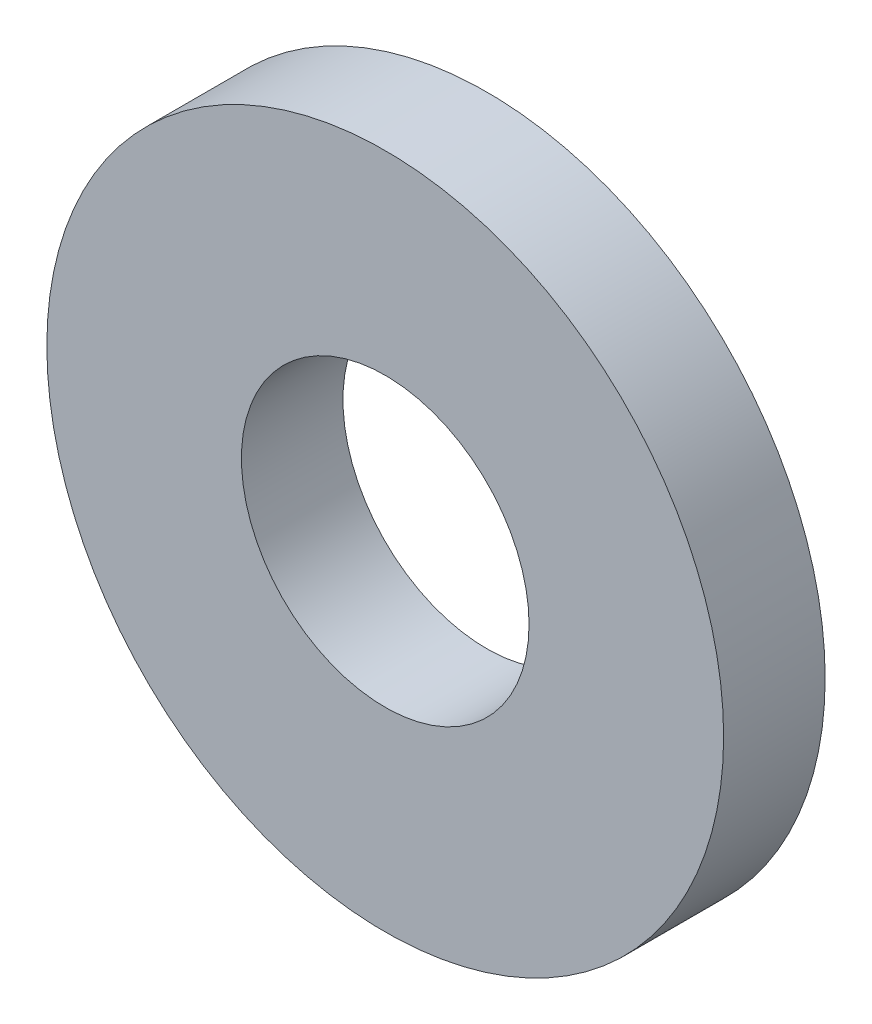
ISO-10303-21;
HEADER;
FILE_DESCRIPTION(('STEP AP214'),'2;1');
FILE_NAME('part.step','',(''),(''),'','','');
FILE_SCHEMA(('AUTOMOTIVE_DESIGN { 1 0 10303 214 1 1 1 1 }'));
ENDSEC;
DATA;
#1=APPLICATION_CONTEXT('core data for automotive mechanical design processes');
#2=APPLICATION_PROTOCOL_DEFINITION('international standard','automotive_design',2000,#1);
#3=PRODUCT_CONTEXT('',#1,'mechanical');
#4=PRODUCT('Part','Part','',(#3));
#5=PRODUCT_RELATED_PRODUCT_CATEGORY('part','',(#4));
#6=PRODUCT_DEFINITION_FORMATION('','',#4);
#7=PRODUCT_DEFINITION_CONTEXT('part definition',#1,'design');
#8=PRODUCT_DEFINITION('design','',#6,#7);
#9=PRODUCT_DEFINITION_SHAPE('','',#8);
#10=(LENGTH_UNIT() NAMED_UNIT(*) SI_UNIT(.MILLI.,.METRE.));
#11=(NAMED_UNIT(*) PLANE_ANGLE_UNIT() SI_UNIT($,.RADIAN.));
#12=(NAMED_UNIT(*) SI_UNIT($,.STERADIAN.) SOLID_ANGLE_UNIT());
#13=UNCERTAINTY_MEASURE_WITH_UNIT(LENGTH_MEASURE(1.E-05),#10,'distance_accuracy_value','');
#14=(GEOMETRIC_REPRESENTATION_CONTEXT(3) GLOBAL_UNCERTAINTY_ASSIGNED_CONTEXT((#13)) GLOBAL_UNIT_ASSIGNED_CONTEXT((#10,
#11,#12)) REPRESENTATION_CONTEXT('',''));
#15=CARTESIAN_POINT('',(0.,0.,0.));
#16=DIRECTION('',(0.,0.,1.));
#17=DIRECTION('',(1.,0.,0.));
#18=AXIS2_PLACEMENT_3D('',#15,#16,#17);
#19=CARTESIAN_POINT('',(349.999999999999,87.,6.));
#20=DIRECTION('',(0.,0.,1.));
#21=DIRECTION('',(1.,0.,0.));
#22=AXIS2_PLACEMENT_3D('',#19,#20,#21);
#23=PLANE('',#22);
#24=CARTESIAN_POINT('',(349.999999999999,87.,6.));
#25=DIRECTION('',(0.,0.,1.));
#26=DIRECTION('',(1.,0.,0.));
#27=AXIS2_PLACEMENT_3D('',#24,#25,#26);
#28=CIRCLE('',#27,20.);
#29=CARTESIAN_POINT('',(369.999999999999,87.,6.));
#30=VERTEX_POINT('',#29);
#31=EDGE_CURVE('E10',#30,#30,#28,.T.);
#32=ORIENTED_EDGE('',*,*,#31,.T.);
#33=EDGE_LOOP('',(#32));
#34=FACE_BOUND('',#33,.T.);
#35=CARTESIAN_POINT('',(349.999999999999,87.,6.));
#36=DIRECTION('',(0.,0.,1.));
#37=DIRECTION('',(1.,0.,0.));
#38=AXIS2_PLACEMENT_3D('',#35,#36,#37);
#39=CIRCLE('',#38,8.50000000000001);
#40=CARTESIAN_POINT('',(358.499999999999,87.,6.));
#41=VERTEX_POINT('',#40);
#42=EDGE_CURVE('E47',#41,#41,#39,.T.);
#43=ORIENTED_EDGE('',*,*,#42,.F.);
#44=EDGE_LOOP('',(#43));
#45=FACE_BOUND('',#44,.T.);
#46=ADVANCED_FACE('F34',(#34,#45),#23,.T.);
#47=CARTESIAN_POINT('',(349.999999999999,87.,0.));
#48=DIRECTION('',(0.,0.,1.));
#49=DIRECTION('',(1.,0.,0.));
#50=AXIS2_PLACEMENT_3D('',#47,#48,#49);
#51=PLANE('',#50);
#52=CARTESIAN_POINT('',(349.999999999999,87.,0.));
#53=DIRECTION('',(0.,0.,1.));
#54=DIRECTION('',(1.,0.,0.));
#55=AXIS2_PLACEMENT_3D('',#52,#53,#54);
#56=CIRCLE('',#55,20.);
#57=CARTESIAN_POINT('',(369.999999999999,87.,0.));
#58=VERTEX_POINT('',#57);
#59=EDGE_CURVE('E38',#58,#58,#56,.T.);
#60=ORIENTED_EDGE('',*,*,#59,.F.);
#61=EDGE_LOOP('',(#60));
#62=FACE_BOUND('',#61,.T.);
#63=CARTESIAN_POINT('',(349.999999999999,87.,0.));
#64=DIRECTION('',(0.,0.,1.));
#65=DIRECTION('',(1.,0.,0.));
#66=AXIS2_PLACEMENT_3D('',#63,#64,#65);
#67=CIRCLE('',#66,8.50000000000001);
#68=CARTESIAN_POINT('',(358.499999999999,87.,0.));
#69=VERTEX_POINT('',#68);
#70=EDGE_CURVE('E49',#69,#69,#67,.T.);
#71=ORIENTED_EDGE('',*,*,#70,.T.);
#72=EDGE_LOOP('',(#71));
#73=FACE_BOUND('',#72,.T.);
#74=ADVANCED_FACE('F61',(#62,#73),#51,.F.);
#75=CARTESIAN_POINT('',(349.999999999999,87.,6.));
#76=DIRECTION('',(0.,0.,-1.));
#77=DIRECTION('',(-1.,0.,0.));
#78=AXIS2_PLACEMENT_3D('',#75,#76,#77);
#79=CYLINDRICAL_SURFACE('',#78,20.);
#80=ORIENTED_EDGE('',*,*,#31,.F.);
#81=EDGE_LOOP('',(#80));
#82=FACE_BOUND('',#81,.T.);
#83=ORIENTED_EDGE('',*,*,#59,.T.);
#84=EDGE_LOOP('',(#83));
#85=FACE_BOUND('',#84,.T.);
#86=ADVANCED_FACE('F36',(#82,#85),#79,.T.);
#87=CARTESIAN_POINT('',(349.999999999999,87.,6.));
#88=DIRECTION('',(0.,0.,-1.));
#89=DIRECTION('',(-1.,0.,0.));
#90=AXIS2_PLACEMENT_3D('',#87,#88,#89);
#91=CYLINDRICAL_SURFACE('',#90,8.50000000000001);
#92=ORIENTED_EDGE('',*,*,#42,.T.);
#93=EDGE_LOOP('',(#92));
#94=FACE_BOUND('',#93,.T.);
#95=ORIENTED_EDGE('',*,*,#70,.F.);
#96=EDGE_LOOP('',(#95));
#97=FACE_BOUND('',#96,.T.);
#98=ADVANCED_FACE('F57',(#94,#97),#91,.F.);
#99=CLOSED_SHELL('',(#46,#74,#86,#98));
#100=MANIFOLD_SOLID_BREP('B2',#99);
#101=ADVANCED_BREP_SHAPE_REPRESENTATION('',(#18,#100),#14);
#102=SHAPE_DEFINITION_REPRESENTATION(#9,#101);
ENDSEC;
END-ISO-10303-21;
